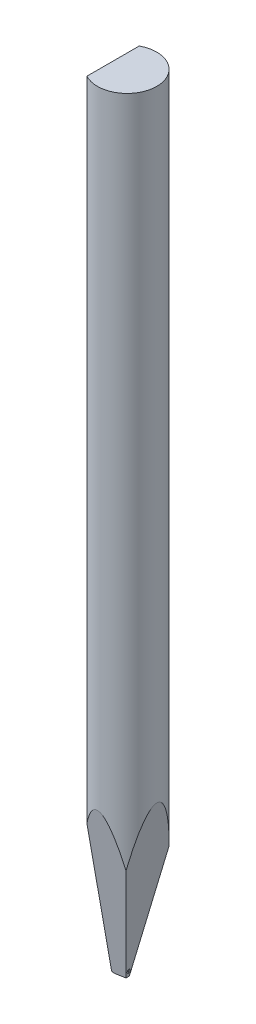
ISO-10303-21;
HEADER;
FILE_DESCRIPTION(('STEP AP214'),'2;1');
FILE_NAME('part.step','',(''),(''),'','','');
FILE_SCHEMA(('AUTOMOTIVE_DESIGN { 1 0 10303 214 1 1 1 1 }'));
ENDSEC;
DATA;
#1=APPLICATION_CONTEXT('core data for automotive mechanical design processes');
#2=APPLICATION_PROTOCOL_DEFINITION('international standard','automotive_design',2000,#1);
#3=PRODUCT_CONTEXT('',#1,'mechanical');
#4=PRODUCT('Part','Part','',(#3));
#5=PRODUCT_RELATED_PRODUCT_CATEGORY('part','',(#4));
#6=PRODUCT_DEFINITION_FORMATION('','',#4);
#7=PRODUCT_DEFINITION_CONTEXT('part definition',#1,'design');
#8=PRODUCT_DEFINITION('design','',#6,#7);
#9=PRODUCT_DEFINITION_SHAPE('','',#8);
#10=(LENGTH_UNIT() NAMED_UNIT(*) SI_UNIT(.MILLI.,.METRE.));
#11=(NAMED_UNIT(*) PLANE_ANGLE_UNIT() SI_UNIT($,.RADIAN.));
#12=(NAMED_UNIT(*) SI_UNIT($,.STERADIAN.) SOLID_ANGLE_UNIT());
#13=UNCERTAINTY_MEASURE_WITH_UNIT(LENGTH_MEASURE(1.E-05),#10,'distance_accuracy_value','');
#14=(GEOMETRIC_REPRESENTATION_CONTEXT(3) GLOBAL_UNCERTAINTY_ASSIGNED_CONTEXT((#13)) GLOBAL_UNIT_ASSIGNED_CONTEXT((#10,
#11,#12)) REPRESENTATION_CONTEXT('',''));
#15=CARTESIAN_POINT('',(0.,0.,0.));
#16=DIRECTION('',(0.,0.,1.));
#17=DIRECTION('',(1.,0.,0.));
#18=AXIS2_PLACEMENT_3D('',#15,#16,#17);
#19=CARTESIAN_POINT('',(26.8738719491216,0.,0.03556));
#20=DIRECTION('',(0.,-0.173648177666931,0.984807753012208));
#21=DIRECTION('',(0.,-0.984807753012208,-0.173648177666931));
#22=AXIS2_PLACEMENT_3D('',#19,#20,#21);
#23=PLANE('',#22);
#24=CARTESIAN_POINT('',(-0.3518916,0.02413,0.039814770044496));
#25=DIRECTION('',(0.,-0.173648177666931,0.984807753012208));
#26=DIRECTION('',(0.,-0.984807753012208,-0.173648177666931));
#27=AXIS2_PLACEMENT_3D('',#24,#25,#26);
#28=ELLIPSE('',#27,0.024502244144803,0.02413);
#29=CARTESIAN_POINT('',(-0.351891599999996,0.,0.0355486570961342));
#30=VERTEX_POINT('',#29);
#31=CARTESIAN_POINT('',(-0.37592,0.0219180114285934,0.0394247367783377));
#32=VERTEX_POINT('',#31);
#33=EDGE_CURVE('E213',#30,#32,#28,.F.);
#34=ORIENTED_EDGE('',*,*,#33,.F.);
#35=CARTESIAN_POINT('',(-0.279400000000003,0.,0.0355373141922684));
#36=DIRECTION('',(-1.,0.,0.));
#37=VECTOR('',#36,1.);
#38=LINE('',#35,#37);
#39=CARTESIAN_POINT('',(-0.279868505851268,-8.26102221984201E-05,0.0359894555492387));
#40=VERTEX_POINT('',#39);
#41=EDGE_CURVE('E241',#40,#30,#38,.T.);
#42=ORIENTED_EDGE('',*,*,#41,.F.);
#43=DIRECTION('',(-0.984346441568213,-0.173566836012845,-0.0306045161452665));
#44=VECTOR('',#43,1.);
#45=CARTESIAN_POINT('',(26.0304347628768,4.6391337266767,0.853564443127717));
#46=LINE('',#45,#44);
#47=CARTESIAN_POINT('',(0.0142086463569767,0.0517711261220242,0.0446886463569738));
#48=VERTEX_POINT('',#47);
#49=EDGE_CURVE('E417',#48,#40,#46,.T.);
#50=ORIENTED_EDGE('',*,*,#49,.F.);
#51=DIRECTION('',(-0.171087869746036,-0.970287525247814,-0.171087869746036));
#52=VECTOR('',#51,1.);
#53=CARTESIAN_POINT('',(0.791557999082992,4.46033837772866,0.822037999082991));
#54=LINE('',#53,#52);
#55=CARTESIAN_POINT('',(0.544920706940428,3.06158878676079,0.575400706940426));
#56=VERTEX_POINT('',#55);
#57=EDGE_CURVE('E424',#56,#48,#54,.T.);
#58=ORIENTED_EDGE('',*,*,#57,.F.);
#59=CARTESIAN_POINT('',(0.,-0.201670781505604,0.));
#60=DIRECTION('',(0.,-0.173648177666931,0.984807753012208));
#61=DIRECTION('',(0.,-0.984807753012208,-0.173648177666931));
#62=AXIS2_PLACEMENT_3D('',#59,#60,#61);
#63=ELLIPSE('',#62,4.56371043248163,0.792479999999998);
#64=CARTESIAN_POINT('',(-0.37592,3.75487126564512,0.69764511322018));
#65=VERTEX_POINT('',#64);
#66=EDGE_CURVE('E548',#56,#65,#63,.T.);
#67=ORIENTED_EDGE('',*,*,#66,.T.);
#68=DIRECTION('',(0.,0.984807753012208,0.173648177666931));
#69=VECTOR('',#68,1.);
#70=CARTESIAN_POINT('',(-0.37592,20.2537184461002,3.60683702172021));
#71=LINE('',#70,#69);
#72=EDGE_CURVE('E54',#32,#65,#71,.T.);
#73=ORIENTED_EDGE('',*,*,#72,.F.);
#74=EDGE_LOOP('',(#34,#42,#50,#58,#67,#73));
#75=FACE_BOUND('',#74,.T.);
#76=ADVANCED_FACE('F46',(#75),#23,.T.);
#77=CARTESIAN_POINT('',(26.8738719491216,0.,-0.03556));
#78=DIRECTION('',(0.,-0.173648177666931,-0.984807753012208));
#79=DIRECTION('',(0.,0.984807753012208,-0.173648177666931));
#80=AXIS2_PLACEMENT_3D('',#77,#78,#79);
#81=PLANE('',#80);
#82=CARTESIAN_POINT('',(-0.3518916,0.02413,-0.039814770044496));
#83=DIRECTION('',(0.,-0.173648177666931,-0.984807753012208));
#84=DIRECTION('',(0.,0.984807753012208,-0.173648177666931));
#85=AXIS2_PLACEMENT_3D('',#82,#83,#84);
#86=ELLIPSE('',#85,0.024502244144803,0.02413);
#87=CARTESIAN_POINT('',(-0.37592,0.0219180114285934,-0.0394247367783381));
#88=VERTEX_POINT('',#87);
#89=CARTESIAN_POINT('',(-0.35189160116382,0.,-0.0355486570961342));
#90=VERTEX_POINT('',#89);
#91=EDGE_CURVE('E173',#88,#90,#86,.F.);
#92=ORIENTED_EDGE('',*,*,#91,.F.);
#93=DIRECTION('',(0.,-0.984807753012208,0.173648177666931));
#94=VECTOR('',#93,1.);
#95=CARTESIAN_POINT('',(-0.37592,20.5281827638758,-3.65523248618578));
#96=LINE('',#95,#94);
#97=CARTESIAN_POINT('',(-0.37592,3.75487126564511,-0.69764511322018));
#98=VERTEX_POINT('',#97);
#99=EDGE_CURVE('E168',#98,#88,#96,.T.);
#100=ORIENTED_EDGE('',*,*,#99,.F.);
#101=CARTESIAN_POINT('',(0.,-0.201670781505604,0.));
#102=DIRECTION('',(0.,-0.173648177666931,-0.984807753012208));
#103=DIRECTION('',(0.,-0.984807753012208,0.173648177666931));
#104=AXIS2_PLACEMENT_3D('',#101,#102,#103);
#105=ELLIPSE('',#104,4.56371043248163,0.792479999999998);
#106=CARTESIAN_POINT('',(0.544920706940428,3.06158878676079,-0.575400706940426));
#107=VERTEX_POINT('',#106);
#108=EDGE_CURVE('E551',#98,#107,#105,.T.);
#109=ORIENTED_EDGE('',*,*,#108,.T.);
#110=DIRECTION('',(0.171087869746036,0.970287525247814,-0.171087869746036));
#111=VECTOR('',#110,1.);
#112=CARTESIAN_POINT('',(0.791557999082992,4.46033837772866,-0.822037999082991));
#113=LINE('',#112,#111);
#114=CARTESIAN_POINT('',(0.0142086463569767,0.0517711261220242,-0.0446886463569738));
#115=VERTEX_POINT('',#114);
#116=EDGE_CURVE('E562',#115,#107,#113,.T.);
#117=ORIENTED_EDGE('',*,*,#116,.F.);
#118=DIRECTION('',(0.984346441568213,0.173566836012845,-0.0306045161452665));
#119=VECTOR('',#118,1.);
#120=CARTESIAN_POINT('',(26.0304347628768,4.6391337266767,-0.853564443127717));
#121=LINE('',#120,#119);
#122=CARTESIAN_POINT('',(-0.279585789658038,-0.000190595003904677,-0.0363998842781737));
#123=VERTEX_POINT('',#122);
#124=EDGE_CURVE('E371',#123,#115,#121,.T.);
#125=ORIENTED_EDGE('',*,*,#124,.F.);
#126=CARTESIAN_POINT('',(-0.279399999999996,0.,-0.03556));
#127=DIRECTION('',(-1.,0.,0.));
#128=VECTOR('',#127,1.);
#129=LINE('',#126,#128);
#130=EDGE_CURVE('E236',#123,#90,#129,.T.);
#131=ORIENTED_EDGE('',*,*,#130,.T.);
#132=EDGE_LOOP('',(#92,#100,#109,#117,#125,#131));
#133=FACE_BOUND('',#132,.T.);
#134=ADVANCED_FACE('F373',(#133),#81,.T.);
#135=CARTESIAN_POINT('',(0.,21.0312,0.));
#136=DIRECTION('',(0.,-1.,0.));
#137=DIRECTION('',(0.,0.,-1.));
#138=AXIS2_PLACEMENT_3D('',#135,#136,#137);
#139=CYLINDRICAL_SURFACE('',#138,0.792479999999998);
#140=ORIENTED_EDGE('',*,*,#66,.F.);
#141=CARTESIAN_POINT('',(0.,-0.0288101116436568,0.));
#142=DIRECTION('',(-0.984807753012208,0.173648177666931,0.));
#143=DIRECTION('',(-0.173648177666931,-0.984807753012208,0.));
#144=AXIS2_PLACEMENT_3D('',#141,#142,#143);
#145=ELLIPSE('',#144,4.56371043248164,0.792479999999998);
#146=EDGE_CURVE('E544',#56,#107,#145,.T.);
#147=ORIENTED_EDGE('',*,*,#146,.T.);
#148=ORIENTED_EDGE('',*,*,#108,.F.);
#149=DIRECTION('',(0.,-1.,0.));
#150=VECTOR('',#149,1.);
#151=CARTESIAN_POINT('',(-0.37592,21.0312,-0.69764511322018));
#152=LINE('',#151,#150);
#153=CARTESIAN_POINT('',(-0.37592,21.0312,-0.69764511322018));
#154=VERTEX_POINT('',#153);
#155=EDGE_CURVE('E557',#154,#98,#152,.T.);
#156=ORIENTED_EDGE('',*,*,#155,.F.);
#157=CARTESIAN_POINT('',(0.,21.0312,0.));
#158=DIRECTION('',(0.,1.,0.));
#159=DIRECTION('',(0.,0.,1.));
#160=AXIS2_PLACEMENT_3D('',#157,#158,#159);
#161=CIRCLE('',#160,0.792479999999998);
#162=CARTESIAN_POINT('',(-0.37592,21.0312,0.69764511322018));
#163=VERTEX_POINT('',#162);
#164=EDGE_CURVE('E559',#163,#154,#161,.T.);
#165=ORIENTED_EDGE('',*,*,#164,.F.);
#166=DIRECTION('',(0.,-1.,0.));
#167=VECTOR('',#166,1.);
#168=CARTESIAN_POINT('',(-0.37592,21.0312,0.69764511322018));
#169=LINE('',#168,#167);
#170=EDGE_CURVE('E555',#65,#163,#169,.F.);
#171=ORIENTED_EDGE('',*,*,#170,.F.);
#172=EDGE_LOOP('',(#140,#147,#148,#156,#165,#171));
#173=FACE_BOUND('',#172,.T.);
#174=ADVANCED_FACE('F382',(#173),#139,.T.);
#175=CARTESIAN_POINT('',(-0.37592,21.0312,-0.80247998));
#176=DIRECTION('',(-1.,0.,0.));
#177=DIRECTION('',(0.,0.,1.));
#178=AXIS2_PLACEMENT_3D('',#175,#176,#177);
#179=PLANE('',#178);
#180=ORIENTED_EDGE('',*,*,#99,.T.);
#181=DIRECTION('',(0.,0.,-1.));
#182=VECTOR('',#181,1.);
#183=CARTESIAN_POINT('',(-0.37592,0.021918011428599,27.135653574335));
#184=LINE('',#183,#182);
#185=CARTESIAN_POINT('',(-0.375920000000287,0.0219181520865931,-0.010266726924701));
#186=VERTEX_POINT('',#185);
#187=EDGE_CURVE('E165',#186,#88,#184,.T.);
#188=ORIENTED_EDGE('',*,*,#187,.F.);
#189=CARTESIAN_POINT('',(-0.37592,0.,0.0355373141922684));
#190=CARTESIAN_POINT('',(-0.37592,0.0123359586796348,0.0261254448351633));
#191=CARTESIAN_POINT('',(-0.37592,0.0241300000000007,0.013381408455424));
#192=CARTESIAN_POINT('',(-0.37592,0.0241300000000007,-0.0133814084554238));
#193=CARTESIAN_POINT('',(-0.37592,0.0123359586796344,-0.026125444835163));
#194=CARTESIAN_POINT('',(-0.37592,0.,-0.0355373141922685));
#195=(BOUNDED_CURVE() B_SPLINE_CURVE(3,(#189,#190,#191,#192,#193,#194),.UNSPECIFIED.,.F.,
.F.) B_SPLINE_CURVE_WITH_KNOTS((4,2,4),(1.35718974229686,1.5707963267949,1.78440291129293),
.UNSPECIFIED.) CURVE() GEOMETRIC_REPRESENTATION_ITEM() RATIONAL_B_SPLINE_CURVE((1.,1.,1.,1.,1.,1.)) REPRESENTATION_ITEM(''));
#196=CARTESIAN_POINT('',(-0.37596017382226,0.0231418144616641,0.0105320158977709));
#197=VERTEX_POINT('',#196);
#198=EDGE_CURVE('E155',#186,#197,#195,.F.);
#199=ORIENTED_EDGE('',*,*,#198,.T.);
#200=EDGE_CURVE('E69',#32,#197,#184,.T.);
#201=ORIENTED_EDGE('',*,*,#200,.F.);
#202=ORIENTED_EDGE('',*,*,#72,.T.);
#203=ORIENTED_EDGE('',*,*,#170,.T.);
#204=DIRECTION('',(0.,0.,-1.));
#205=VECTOR('',#204,1.);
#206=CARTESIAN_POINT('',(-0.37592,21.0312,-0.80247998));
#207=LINE('',#206,#205);
#208=EDGE_CURVE('E553',#163,#154,#207,.T.);
#209=ORIENTED_EDGE('',*,*,#208,.T.);
#210=ORIENTED_EDGE('',*,*,#155,.T.);
#211=EDGE_LOOP('',(#180,#188,#199,#201,#202,#203,#209,#210));
#212=FACE_BOUND('',#211,.T.);
#213=ADVANCED_FACE('F166',(#212),#179,.T.);
#214=CARTESIAN_POINT('',(0.,21.0312,0.));
#215=DIRECTION('',(0.,1.,0.));
#216=DIRECTION('',(0.,0.,1.));
#217=AXIS2_PLACEMENT_3D('',#214,#215,#216);
#218=PLANE('',#217);
#219=ORIENTED_EDGE('',*,*,#164,.T.);
#220=ORIENTED_EDGE('',*,*,#208,.F.);
#221=EDGE_LOOP('',(#219,#220));
#222=FACE_BOUND('',#221,.T.);
#223=ADVANCED_FACE('F321',(#222),#218,.T.);
#224=CARTESIAN_POINT('',(-0.2794,0.,27.2760283406468));
#225=DIRECTION('',(-0.173648177666931,0.984807753012208,0.));
#226=DIRECTION('',(-0.984807753012208,-0.173648177666931,0.));
#227=AXIS2_PLACEMENT_3D('',#224,#225,#226);
#228=PLANE('',#227);
#229=DIRECTION('',(-0.984807753012208,-0.173648177666931,0.));
#230=VECTOR('',#229,1.);
#231=CARTESIAN_POINT('',(-0.2794,0.,-0.0228599999999995));
#232=LINE('',#231,#230);
#233=CARTESIAN_POINT('',(-0.1143,0.0291115845149677,-0.0228599999999998));
#234=VERTEX_POINT('',#233);
#235=CARTESIAN_POINT('',(-0.171062019412121,0.0191029090131131,-0.0228599999999995));
#236=VERTEX_POINT('',#235);
#237=EDGE_CURVE('E362',#234,#236,#232,.T.);
#238=ORIENTED_EDGE('',*,*,#237,.T.);
#239=CARTESIAN_POINT('',(-0.171062019412121,0.0191029090131133,-0.04318));
#240=DIRECTION('',(-0.173648177666931,0.984807753012208,0.));
#241=DIRECTION('',(-0.984807753012208,-0.173648177666931,0.));
#242=AXIS2_PLACEMENT_3D('',#239,#240,#241);
#243=ELLIPSE('',#242,0.117018216217478,0.02032);
#244=CARTESIAN_POINT('',(-0.267374476028883,0.00212042433326444,-0.0320221500864637));
#245=VERTEX_POINT('',#244);
#246=EDGE_CURVE('E278',#236,#245,#243,.F.);
#247=ORIENTED_EDGE('',*,*,#246,.T.);
#248=CARTESIAN_POINT('',(-0.280333497948036,-0.000164600883192114,-0.0364561339674381));
#249=CARTESIAN_POINT('',(-0.280155070497286,-0.000133136917720893,-0.036340628658351));
#250=CARTESIAN_POINT('',(-0.279973654415229,-0.000101068426490088,-0.0362300582978318));
#251=CARTESIAN_POINT('',(-0.279598555472457,-3.4658318876143E-05,-0.0360134000993459));
#252=CARTESIAN_POINT('',(-0.279404672441793,-2.77117807226393E-07,-0.0359076698614077));
#253=CARTESIAN_POINT('',(-0.279004881471679,7.06715381127732E-05,-0.0357002716689471));
#254=CARTESIAN_POINT('',(-0.278798804851058,0.000107271091862301,-0.035598942724127));
#255=CARTESIAN_POINT('',(-0.278374758328196,0.000182595203422804,-0.0353999293598517));
#256=CARTESIAN_POINT('',(-0.278156645520469,0.000221345659338753,-0.0353025606037825));
#257=CARTESIAN_POINT('',(-0.277708658167392,0.000300912638919081,-0.0351110156351709));
#258=CARTESIAN_POINT('',(-0.277478664625113,0.000341749351662017,-0.0350171276663814));
#259=CARTESIAN_POINT('',(-0.277007015949581,0.000425440776471455,-0.0348320822852496));
#260=CARTESIAN_POINT('',(-0.27676526231971,0.000468310873968494,-0.034741184281488));
#261=CARTESIAN_POINT('',(-0.276008109142046,0.000602458118121683,-0.0344664990491234));
#262=CARTESIAN_POINT('',(-0.275489221156904,0.000694221265936668,-0.0342925905564617));
#263=CARTESIAN_POINT('',(-0.274405958507615,0.000885393058399262,-0.0339485287291992));
#264=CARTESIAN_POINT('',(-0.273841176891778,0.000984842757572743,-0.0337797124463461));
#265=CARTESIAN_POINT('',(-0.272666201099527,0.00119139278403715,-0.0334413186521607));
#266=CARTESIAN_POINT('',(-0.272055759373374,0.00129851092615172,-0.0332726220357182));
#267=CARTESIAN_POINT('',(-0.270789526175272,0.0015205709643942,-0.0329293232876879));
#268=CARTESIAN_POINT('',(-0.270133618528723,0.00163552364341038,-0.0327551637623434));
#269=CARTESIAN_POINT('',(-0.268776345142181,0.00187368786077839,-0.0323957280937868));
#270=CARTESIAN_POINT('',(-0.268074966685623,0.00199692178243328,-0.0322105143972571));
#271=CARTESIAN_POINT('',(-0.267374476031968,0.00212042435076266,-0.0320221500864627));
#272=B_SPLINE_CURVE_WITH_KNOTS('',3,(#248,#249,#250,#251,#252,#253,#254,#255,#256,#257,#258,
#259,#260,#261,#262,#263,#264,#265,#266,#267,#268,#269,#270,#271),.UNSPECIFIED.,.F.,.F.,(4,2,2,
2,2,2,2,2,2,2,2,4),(0.,0.000644403256786334,0.00131464962442115,0.00201209736790709,
0.00273790077589257,0.00349304918435483,0.00427840099063897,0.00594258166803204,
0.00773581701858617,0.00966269499168276,0.0117276015745993,0.0139350378186592),.UNSPECIFIED.);
#273=EDGE_CURVE('E341',#245,#123,#272,.F.);
#274=ORIENTED_EDGE('',*,*,#273,.T.);
#275=ORIENTED_EDGE('',*,*,#124,.T.);
#276=DIRECTION('',(0.,0.,-1.));
#277=VECTOR('',#276,1.);
#278=CARTESIAN_POINT('',(0.0142086463569737,0.0517711261220249,27.2760283406468));
#279=LINE('',#278,#277);
#280=EDGE_CURVE('E423',#48,#115,#279,.T.);
#281=ORIENTED_EDGE('',*,*,#280,.F.);
#282=ORIENTED_EDGE('',*,*,#49,.T.);
#283=CARTESIAN_POINT('',(-0.267374173647564,0.00215307346705205,0.0320435292332376));
#284=CARTESIAN_POINT('',(-0.268082885431075,0.00202931965629134,0.0322349808760758));
#285=CARTESIAN_POINT('',(-0.268792438835196,0.00190513734656913,0.0324229896451083));
#286=CARTESIAN_POINT('',(-0.270162321116317,0.00166463826845671,0.0327863461831401));
#287=CARTESIAN_POINT('',(-0.270822664633382,0.00154837070814446,0.0329616714506038));
#288=CARTESIAN_POINT('',(-0.272095067230392,0.00132351987416095,0.0333058478048767));
#289=CARTESIAN_POINT('',(-0.272707243817517,0.00121497360617393,0.0334742820909874));
#290=CARTESIAN_POINT('',(-0.273883763905877,0.00100557278077867,0.0338109189836498));
#291=CARTESIAN_POINT('',(-0.274448355665751,0.000904731491622197,0.033978251939496));
#292=CARTESIAN_POINT('',(-0.275529898733176,0.000710867252534142,0.0343182959951879));
#293=CARTESIAN_POINT('',(-0.276047256219702,0.000617823388709614,0.0344896698862049));
#294=CARTESIAN_POINT('',(-0.276801873122328,0.000481711213552321,0.0347599859975484));
#295=CARTESIAN_POINT('',(-0.277042507217535,0.000438246834182285,0.0348492792422128));
#296=CARTESIAN_POINT('',(-0.277511738389133,0.000353391187461877,0.0350309150056344));
#297=CARTESIAN_POINT('',(-0.277740433873042,0.000311986160541231,0.0351229954457454));
#298=CARTESIAN_POINT('',(-0.278185686137927,0.000231301139131407,0.0353107436831354));
#299=CARTESIAN_POINT('',(-0.278402361946502,0.000192002508565462,0.0354061195792356));
#300=CARTESIAN_POINT('',(-0.278823429759548,0.000115592439001881,0.0356009843447664));
#301=CARTESIAN_POINT('',(-0.279027964989783,7.84566637652888E-05,0.0357001527662635));
#302=CARTESIAN_POINT('',(-0.279424599746804,6.43603412709969E-06,0.0359030845817691));
#303=CARTESIAN_POINT('',(-0.279616868669867,-2.84792977134749E-05,0.0360065030545373));
#304=CARTESIAN_POINT('',(-0.27998869205088,-9.5968954295525E-05,0.0362184129740459));
#305=CARTESIAN_POINT('',(-0.280168448168133,-0.000128581175170421,0.036326539653624));
#306=CARTESIAN_POINT('',(-0.280345277736324,-0.000160629395019782,0.0364395611564484));
#307=B_SPLINE_CURVE_WITH_KNOTS('',3,(#283,#284,#285,#286,#287,#288,#289,#290,#291,#292,#293,
#294,#295,#296,#297,#298,#299,#300,#301,#302,#303,#304,#305,#306),.UNSPECIFIED.,.F.,.F.,(4,2,2,
2,2,2,2,2,2,2,2,4),(0.,0.00223340647109862,0.00431253981722064,0.00624488707666015,
0.00803705014398884,0.0096952366864093,0.0104761224270785,0.0112259848073902,0.0119457789440838,
0.0126365778181985,0.0132996096991451,0.0139363005881362),.UNSPECIFIED.);
#308=CARTESIAN_POINT('',(-0.267374257696495,0.00212046283115514,0.0320220915086163));
#309=VERTEX_POINT('',#308);
#310=EDGE_CURVE('E349',#40,#309,#307,.F.);
#311=ORIENTED_EDGE('',*,*,#310,.T.);
#312=CARTESIAN_POINT('',(-0.171062019412121,0.0191029090131133,0.04318));
#313=DIRECTION('',(-0.173648177666931,0.984807753012208,0.));
#314=DIRECTION('',(-0.984807753012208,-0.173648177666931,0.));
#315=AXIS2_PLACEMENT_3D('',#312,#313,#314);
#316=ELLIPSE('',#315,0.117018216217478,0.02032);
#317=CARTESIAN_POINT('',(-0.17106201941212,0.0191029090131133,0.0228599999999998));
#318=VERTEX_POINT('',#317);
#319=EDGE_CURVE('E345',#309,#318,#316,.F.);
#320=ORIENTED_EDGE('',*,*,#319,.T.);
#321=DIRECTION('',(-0.984807753012208,-0.173648177666931,0.));
#322=VECTOR('',#321,1.);
#323=CARTESIAN_POINT('',(-0.2794,0.,0.0228599999999995));
#324=LINE('',#323,#322);
#325=CARTESIAN_POINT('',(-0.1143,0.0291115845149677,0.0228599999999998));
#326=VERTEX_POINT('',#325);
#327=EDGE_CURVE('E353',#326,#318,#324,.T.);
#328=ORIENTED_EDGE('',*,*,#327,.F.);
#329=DIRECTION('',(0.,0.,1.));
#330=VECTOR('',#329,1.);
#331=CARTESIAN_POINT('',(-0.1143,0.0291115845149677,27.2760283406468));
#332=LINE('',#331,#330);
#333=EDGE_CURVE('E358',#234,#326,#332,.T.);
#334=ORIENTED_EDGE('',*,*,#333,.F.);
#335=EDGE_LOOP('',(#238,#247,#274,#275,#281,#282,#311,#320,#328,#334));
#336=FACE_BOUND('',#335,.T.);
#337=ADVANCED_FACE('F316',(#336),#228,.F.);
#338=CARTESIAN_POINT('',(0.0142086463569737,0.0517711261220249,27.2760283406468));
#339=DIRECTION('',(-0.984807753012208,0.173648177666931,0.));
#340=DIRECTION('',(-0.173648177666931,-0.984807753012208,0.));
#341=AXIS2_PLACEMENT_3D('',#338,#339,#340);
#342=PLANE('',#341);
#343=CARTESIAN_POINT('',(0.0401727059586961,0.199020625304743,0.));
#344=DIRECTION('',(-0.984807753012208,0.173648177666931,0.));
#345=DIRECTION('',(0.173648177666931,0.984807753012208,0.));
#346=AXIS2_PLACEMENT_3D('',#343,#344,#345);
#347=ELLIPSE('',#346,0.0515734368592615,0.0370444608655554);
#348=CARTESIAN_POINT('',(0.0491283392853274,0.249810545773229,0.));
#349=VERTEX_POINT('',#348);
#350=EDGE_CURVE('E539',#349,#349,#347,.F.);
#351=ORIENTED_EDGE('',*,*,#350,.F.);
#352=EDGE_LOOP('',(#351));
#353=FACE_BOUND('',#352,.T.);
#354=ORIENTED_EDGE('',*,*,#146,.F.);
#355=ORIENTED_EDGE('',*,*,#57,.T.);
#356=ORIENTED_EDGE('',*,*,#280,.T.);
#357=ORIENTED_EDGE('',*,*,#116,.T.);
#358=EDGE_LOOP('',(#354,#355,#356,#357));
#359=FACE_BOUND('',#358,.T.);
#360=ADVANCED_FACE('F311',(#353,#359),#342,.F.);
#361=CARTESIAN_POINT('',(-0.224144167394209,0.0939800000000001,0.));
#362=DIRECTION('',(-0.500000000000004,-0.866025403784436,0.));
#363=DIRECTION('',(0.866025403784436,-0.500000000000004,0.));
#364=AXIS2_PLACEMENT_3D('',#361,#362,#363);
#365=CYLINDRICAL_SURFACE('',#364,0.02286);
#366=DIRECTION('',(-0.500000000000004,-0.866025403784436,0.));
#367=VECTOR('',#366,1.);
#368=CARTESIAN_POINT('',(-0.208802659269487,0.120552271536749,0.02286));
#369=LINE('',#368,#367);
#370=CARTESIAN_POINT('',(-0.224144167394209,0.0939800000000001,0.02286));
#371=VERTEX_POINT('',#370);
#372=CARTESIAN_POINT('',(-0.267372013928851,0.0191071735002097,0.02286));
#373=VERTEX_POINT('',#372);
#374=EDGE_CURVE('E260',#371,#373,#369,.T.);
#375=ORIENTED_EDGE('',*,*,#374,.T.);
#376=CARTESIAN_POINT('',(-0.267374476031878,0.0191029090130334,-0.02286));
#377=CARTESIAN_POINT('',(-0.275895760983117,0.0164196561236254,-0.0228599999999525));
#378=CARTESIAN_POINT('',(-0.283804636099305,0.0149415704065285,-0.0204869191309508));
#379=CARTESIAN_POINT('',(-0.294991553142782,0.0138166529596041,-0.0107104045754606));
#380=CARTESIAN_POINT('',(-0.297768361827201,0.0139542855985028,-0.00310771898830106));
#381=CARTESIAN_POINT('',(-0.294909474530602,0.0139949484763086,0.0109660536144084));
#382=CARTESIAN_POINT('',(-0.28955299666881,0.0140922856862379,0.0168379500019212));
#383=CARTESIAN_POINT('',(-0.27538921998688,0.0165985464362655,0.0230240317134643));
#384=CARTESIAN_POINT('',(-0.26693681668608,0.0189220985514332,0.0238016005882103));
#385=CARTESIAN_POINT('',(-0.257498919852931,0.0225827524218857,0.0218212881158467));
#386=(BOUNDED_CURVE() B_SPLINE_CURVE(3,(#376,#377,#378,#379,#380,#381,#382,#383,#384,#385),
.UNSPECIFIED.,.F.,.F.) B_SPLINE_CURVE_WITH_KNOTS((4,2,2,2,4),(-1.47682958571218E-05,
9.3852680534188E-06,3.35388319639594E-05,5.76923958745E-05,8.18459597850407E-05),
.UNSPECIFIED.) CURVE() GEOMETRIC_REPRESENTATION_ITEM() RATIONAL_B_SPLINE_CURVE((1.,1.,1.,1.,1.,
1.,1.,1.,1.,1.)) REPRESENTATION_ITEM(''));
#387=CARTESIAN_POINT('',(-0.267374476031722,0.0191029090129434,-0.02286));
#388=VERTEX_POINT('',#387);
#389=EDGE_CURVE('E284',#373,#388,#386,.F.);
#390=ORIENTED_EDGE('',*,*,#389,.T.);
#391=DIRECTION('',(0.500000000000004,0.866025403784436,0.));
#392=VECTOR('',#391,1.);
#393=CARTESIAN_POINT('',(-0.224144167394209,0.0939800000000001,-0.02286));
#394=LINE('',#393,#392);
#395=CARTESIAN_POINT('',(-0.224144167394209,0.0939800000000001,-0.02286));
#396=VERTEX_POINT('',#395);
#397=EDGE_CURVE('E272',#388,#396,#394,.T.);
#398=ORIENTED_EDGE('',*,*,#397,.T.);
#399=CARTESIAN_POINT('',(-0.224144167394209,0.0939800000000001,0.));
#400=DIRECTION('',(0.,-1.,0.));
#401=DIRECTION('',(-1.,0.,0.));
#402=AXIS2_PLACEMENT_3D('',#399,#400,#401);
#403=ELLIPSE('',#402,0.0263964543073498,0.02286);
#404=EDGE_CURVE('E282',#396,#371,#403,.F.);
#405=ORIENTED_EDGE('',*,*,#404,.T.);
#406=EDGE_LOOP('',(#375,#390,#398,#405));
#407=FACE_BOUND('',#406,.T.);
#408=ADVANCED_FACE('F297',(#407),#365,.F.);
#409=CARTESIAN_POINT('',(-0.1143,0.0939800000000001,0.02286));
#410=DIRECTION('',(-1.,0.,0.));
#411=DIRECTION('',(0.,0.,1.));
#412=AXIS2_PLACEMENT_3D('',#409,#410,#411);
#413=PLANE('',#412);
#414=ORIENTED_EDGE('',*,*,#333,.T.);
#415=DIRECTION('',(0.,1.,0.));
#416=VECTOR('',#415,1.);
#417=CARTESIAN_POINT('',(-0.1143,0.0939800000000001,0.02286));
#418=LINE('',#417,#416);
#419=CARTESIAN_POINT('',(-0.1143,0.0939800000000001,0.02286));
#420=VERTEX_POINT('',#419);
#421=EDGE_CURVE('E257',#326,#420,#418,.T.);
#422=ORIENTED_EDGE('',*,*,#421,.T.);
#423=CARTESIAN_POINT('',(-0.1143,0.09398,0.));
#424=DIRECTION('',(1.,0.,0.));
#425=DIRECTION('',(0.,1.,0.));
#426=AXIS2_PLACEMENT_3D('',#423,#424,#425);
#427=ELLIPSE('',#426,0.0263964543073496,0.02286);
#428=CARTESIAN_POINT('',(-0.1143,0.0939800000000001,-0.0228599999999995));
#429=VERTEX_POINT('',#428);
#430=EDGE_CURVE('E250',#429,#420,#427,.F.);
#431=ORIENTED_EDGE('',*,*,#430,.F.);
#432=DIRECTION('',(0.,1.,0.));
#433=VECTOR('',#432,1.);
#434=CARTESIAN_POINT('',(-0.1143,0.0939800000000001,-0.02286));
#435=LINE('',#434,#433);
#436=EDGE_CURVE('E258',#234,#429,#435,.T.);
#437=ORIENTED_EDGE('',*,*,#436,.F.);
#438=EDGE_LOOP('',(#414,#422,#431,#437));
#439=FACE_BOUND('',#438,.T.);
#440=ADVANCED_FACE('F310',(#439),#413,.T.);
#441=CARTESIAN_POINT('',(0.,0.,0.02286));
#442=DIRECTION('',(0.,0.,-1.));
#443=DIRECTION('',(-1.,0.,0.));
#444=AXIS2_PLACEMENT_3D('',#441,#442,#443);
#445=PLANE('',#444);
#446=ORIENTED_EDGE('',*,*,#327,.T.);
#447=DIRECTION('',(1.,0.,0.));
#448=VECTOR('',#447,1.);
#449=CARTESIAN_POINT('',(-0.277107942966048,0.0191029090131133,0.02286));
#450=LINE('',#449,#448);
#451=EDGE_CURVE('E275',#318,#373,#450,.F.);
#452=ORIENTED_EDGE('',*,*,#451,.T.);
#453=ORIENTED_EDGE('',*,*,#374,.F.);
#454=DIRECTION('',(-1.,0.,0.));
#455=VECTOR('',#454,1.);
#456=CARTESIAN_POINT('',(-0.250540621701558,0.0939800000000001,0.02286));
#457=LINE('',#456,#455);
#458=EDGE_CURVE('E254',#420,#371,#457,.T.);
#459=ORIENTED_EDGE('',*,*,#458,.F.);
#460=ORIENTED_EDGE('',*,*,#421,.F.);
#461=EDGE_LOOP('',(#446,#452,#453,#459,#460));
#462=FACE_BOUND('',#461,.T.);
#463=ADVANCED_FACE('F534',(#462),#445,.T.);
#464=CARTESIAN_POINT('',(0.,0.,-0.02286));
#465=DIRECTION('',(0.,0.,-1.));
#466=DIRECTION('',(-1.,0.,0.));
#467=AXIS2_PLACEMENT_3D('',#464,#465,#466);
#468=PLANE('',#467);
#469=ORIENTED_EDGE('',*,*,#397,.F.);
#470=DIRECTION('',(-1.,0.,0.));
#471=VECTOR('',#470,1.);
#472=CARTESIAN_POINT('',(0.,0.0191029090131133,-0.02286));
#473=LINE('',#472,#471);
#474=EDGE_CURVE('E277',#388,#236,#473,.F.);
#475=ORIENTED_EDGE('',*,*,#474,.T.);
#476=ORIENTED_EDGE('',*,*,#237,.F.);
#477=ORIENTED_EDGE('',*,*,#436,.T.);
#478=DIRECTION('',(-1.,0.,0.));
#479=VECTOR('',#478,1.);
#480=CARTESIAN_POINT('',(-0.250540621701558,0.0939800000000001,-0.02286));
#481=LINE('',#480,#479);
#482=EDGE_CURVE('E253',#429,#396,#481,.T.);
#483=ORIENTED_EDGE('',*,*,#482,.T.);
#484=EDGE_LOOP('',(#469,#475,#476,#477,#483));
#485=FACE_BOUND('',#484,.T.);
#486=ADVANCED_FACE('F700',(#485),#468,.F.);
#487=CARTESIAN_POINT('',(0.0122322627883964,0.167033435982052,0.));
#488=DIRECTION('',(0.866025403784441,0.499999999999995,0.));
#489=DIRECTION('',(-0.499999999999995,0.866025403784441,0.));
#490=AXIS2_PLACEMENT_3D('',#487,#488,#489);
#491=CONICAL_SURFACE('',#490,0.02286,0.392699081698725);
#492=CARTESIAN_POINT('',(0.0122322627883964,0.167033435982052,0.));
#493=DIRECTION('',(0.866025403784441,0.499999999999995,0.));
#494=DIRECTION('',(-0.499999999999995,0.866025403784441,0.));
#495=AXIS2_PLACEMENT_3D('',#492,#493,#494);
#496=CIRCLE('',#495,0.02286);
#497=CARTESIAN_POINT('',(0.00080226278839655,0.186830776712565,0.));
#498=VERTEX_POINT('',#497);
#499=EDGE_CURVE('E243',#498,#498,#496,.T.);
#500=ORIENTED_EDGE('',*,*,#499,.F.);
#501=EDGE_LOOP('',(#500));
#502=FACE_BOUND('',#501,.T.);
#503=ORIENTED_EDGE('',*,*,#350,.T.);
#504=EDGE_LOOP('',(#503));
#505=FACE_BOUND('',#504,.T.);
#506=ADVANCED_FACE('F691',(#502,#505),#491,.F.);
#507=CARTESIAN_POINT('',(-0.250540621701558,0.0939800000000001,0.02286));
#508=DIRECTION('',(0.,-1.,0.));
#509=DIRECTION('',(0.,0.,-1.));
#510=AXIS2_PLACEMENT_3D('',#507,#508,#509);
#511=PLANE('',#510);
#512=ORIENTED_EDGE('',*,*,#482,.F.);
#513=CARTESIAN_POINT('',(-0.1143,0.0939800000000001,0.));
#514=DIRECTION('',(0.,1.,0.));
#515=DIRECTION('',(1.,0.,0.));
#516=AXIS2_PLACEMENT_3D('',#513,#514,#515);
#517=ELLIPSE('',#516,0.0457200000000004,0.02286);
#518=EDGE_CURVE('E246',#420,#429,#517,.F.);
#519=ORIENTED_EDGE('',*,*,#518,.F.);
#520=ORIENTED_EDGE('',*,*,#458,.T.);
#521=ORIENTED_EDGE('',*,*,#404,.F.);
#522=EDGE_LOOP('',(#512,#519,#520,#521));
#523=FACE_BOUND('',#522,.T.);
#524=ADVANCED_FACE('F312',(#523),#511,.T.);
#525=CARTESIAN_POINT('',(-0.361071138175361,-0.0484933830537733,0.));
#526=DIRECTION('',(0.866025403784441,0.499999999999995,0.));
#527=DIRECTION('',(-0.499999999999995,0.866025403784441,0.));
#528=AXIS2_PLACEMENT_3D('',#525,#526,#527);
#529=CYLINDRICAL_SURFACE('',#528,0.02286);
#530=ORIENTED_EDGE('',*,*,#430,.T.);
#531=ORIENTED_EDGE('',*,*,#518,.T.);
#532=EDGE_LOOP('',(#530,#531));
#533=FACE_BOUND('',#532,.T.);
#534=ORIENTED_EDGE('',*,*,#499,.T.);
#535=EDGE_LOOP('',(#534));
#536=FACE_BOUND('',#535,.T.);
#537=ADVANCED_FACE('F607',(#533,#536),#529,.F.);
#538=CARTESIAN_POINT('',(26.7532219491216,-0.16383,0.));
#539=DIRECTION('',(-1.,0.,0.));
#540=DIRECTION('',(0.,0.,1.));
#541=AXIS2_PLACEMENT_3D('',#538,#539,#540);
#542=CYLINDRICAL_SURFACE('',#541,0.16764);
#543=ORIENTED_EDGE('',*,*,#41,.T.);
#544=CARTESIAN_POINT('',(-0.3518916,0.,0.0355373141922684));
#545=CARTESIAN_POINT('',(-0.352251268342653,-3.1644969071811E-07,0.0355385995095474));
#546=CARTESIAN_POINT('',(-0.352609039601553,8.02818367780947E-06,0.035500318254268));
#547=CARTESIAN_POINT('',(-0.353305255703916,3.90463941921952E-05,0.0353569439486636));
#548=CARTESIAN_POINT('',(-0.353643903507041,6.15137569732996E-05,0.0352528122895414));
#549=CARTESIAN_POINT('',(-0.354295214243823,0.000117763185050622,0.0349902438494591));
#550=CARTESIAN_POINT('',(-0.354608022572586,0.000151475665794418,0.0348321409041775));
#551=CARTESIAN_POINT('',(-0.355208581302935,0.000227153868779776,0.034473962319524));
#552=CARTESIAN_POINT('',(-0.355496229178868,0.000269151278077996,0.0342737253292812));
#553=CARTESIAN_POINT('',(-0.356270710683659,0.000395250314370916,0.0336659216504462));
#554=CARTESIAN_POINT('',(-0.356728260395176,0.000485716625125136,0.0332226300592517));
#555=CARTESIAN_POINT('',(-0.357573022670499,0.000674415716683586,0.0322754539316978));
#556=CARTESIAN_POINT('',(-0.357960019343308,0.000772671057965837,0.0317713910024807));
#557=CARTESIAN_POINT('',(-0.359058129172298,0.00107580067057533,0.0301733027579081));
#558=CARTESIAN_POINT('',(-0.359679433698047,0.00128358971705124,0.0290188780669844));
#559=CARTESIAN_POINT('',(-0.360766848765377,0.00168436492622039,0.0266393127268761));
#560=CARTESIAN_POINT('',(-0.361232581402639,0.00187731417930728,0.0254140082426635));
#561=CARTESIAN_POINT('',(-0.362622871092907,0.00248985705969784,0.0212073753235609));
#562=CARTESIAN_POINT('',(-0.36329409987197,0.00285492843747878,0.0181353476658935));
#563=CARTESIAN_POINT('',(-0.364278279349108,0.00341576574656757,0.011914135200303));
#564=CARTESIAN_POINT('',(-0.364589261352639,0.00361059994835304,0.00876462159404117));
#565=CARTESIAN_POINT('',(-0.365009678841964,0.00387434920441847,0.000878520987366361));
#566=CARTESIAN_POINT('',(-0.364942834586346,0.00383299736486849,-0.00387100770457962));
#567=CARTESIAN_POINT('',(-0.36416903131961,0.0033480122256045,-0.0132807766905089));
#568=CARTESIAN_POINT('',(-0.36346762607949,0.00290786915558281,-0.0179414340867087));
#569=CARTESIAN_POINT('',(-0.361937525669933,0.00218943506643746,-0.0232698617756675));
#570=CARTESIAN_POINT('',(-0.361670936734846,0.00206830252842352,-0.0241173628313344));
#571=CARTESIAN_POINT('',(-0.361081100183904,0.00181590566569847,-0.0257937219690029));
#572=CARTESIAN_POINT('',(-0.360757711149149,0.00168461652098595,-0.0266225275511856));
#573=CARTESIAN_POINT('',(-0.359987399278323,0.00139436321864785,-0.0283722163485569));
#574=CARTESIAN_POINT('',(-0.359529178320922,0.00123422218073195,-0.029287993525864));
#575=CARTESIAN_POINT('',(-0.35848806022634,0.00091265778824753,-0.0310452521133025));
#576=CARTESIAN_POINT('',(-0.357905783819933,0.000751244535880948,-0.0318870749858256));
#577=CARTESIAN_POINT('',(-0.356962212388882,0.000537175877259494,-0.0329652175868421));
#578=CARTESIAN_POINT('',(-0.356674976179315,0.000476848448842134,-0.0332642866227097));
#579=CARTESIAN_POINT('',(-0.356065905294942,0.000361768756805535,-0.0338277165810855));
#580=CARTESIAN_POINT('',(-0.355744027249446,0.000307023653007552,-0.0340920330529995));
#581=CARTESIAN_POINT('',(-0.355057783372287,0.000206073174392215,-0.0345745305900033));
#582=CARTESIAN_POINT('',(-0.354692840587474,0.000160011974018704,-0.0347919401869191));
#583=CARTESIAN_POINT('',(-0.35392739307815,8.30042228159121E-05,-0.0351529694942786));
#584=CARTESIAN_POINT('',(-0.35352709751998,5.19749993899241E-05,-0.0352969930442584));
#585=CARTESIAN_POINT('',(-0.35291574394059,2.09077143094453E-05,-0.0354408230247105));
#586=CARTESIAN_POINT('',(-0.352713284747334,1.31384500590778E-05,-0.0354767046674955));
#587=CARTESIAN_POINT('',(-0.352304505346337,2.655768193882E-06,-0.0355250720129181));
#588=CARTESIAN_POINT('',(-0.352098171370407,-3.34685002867517E-08,-0.0355374458198908));
#589=CARTESIAN_POINT('',(-0.351891600000658,-1.69125610184529E-13,-0.0355373141950322));
#590=B_SPLINE_CURVE_WITH_KNOTS('',3,(#544,#545,#546,#547,#548,#549,#550,#551,#552,#553,#554,
#555,#556,#557,#558,#559,#560,#561,#562,#563,#564,#565,#566,#567,#568,#569,#570,#571,#572,#573,
#574,#575,#576,#577,#578,#579,#580,#581,#582,#583,#584,#585,#586,#587,#588,#589),.UNSPECIFIED.,
.F.,.F.,(4,2,2,2,2,2,2,2,2,2,2,2,2,2,2,2,2,2,2,2,2,2,4),(0.,0.00107387793307747,
0.00213242859854409,0.00318454687300627,0.00424077001276429,0.0061599933015218,
0.00808499425946905,0.0120448307551851,0.0160142174212676,0.0254592668811319,0.0349556921836507,
0.0491587337563986,0.0632386581819932,0.0659271174774281,0.0686223678254726,0.0717265046140596,
0.07481545959662,0.0760704044702183,0.0773269391934501,0.0786027851340055,0.0798715322106305,
0.0804875134550958,0.0811064194522882),.UNSPECIFIED.);
#591=CARTESIAN_POINT('',(-0.36293584853417,0.00268715662575408,0.0193637586740646));
#592=VERTEX_POINT('',#591);
#593=EDGE_CURVE('E172',#30,#592,#590,.T.);
#594=ORIENTED_EDGE('',*,*,#593,.T.);
#595=CARTESIAN_POINT('',(-0.37592,0.,-0.0355373141922685));
#596=CARTESIAN_POINT('',(-0.365756940225437,0.00252981156072762,-0.0238746706466237));
#597=CARTESIAN_POINT('',(-0.355600000000001,0.00381000000000001,-0.0119362651530878));
#598=CARTESIAN_POINT('',(-0.355600000000001,0.00381,0.0119362651530881));
#599=CARTESIAN_POINT('',(-0.365756940225437,0.00252981156072763,0.0238746706466237));
#600=CARTESIAN_POINT('',(-0.37592,0.,0.0355373141922684));
#601=(BOUNDED_CURVE() B_SPLINE_CURVE(3,(#595,#596,#597,#598,#599,#600),.UNSPECIFIED.,.F.,
.F.) B_SPLINE_CURVE_WITH_KNOTS((4,2,4),(1.35718974229686,1.5707963267949,1.78440291129293),
.UNSPECIFIED.) CURVE() GEOMETRIC_REPRESENTATION_ITEM() RATIONAL_B_SPLINE_CURVE((1.,1.,1.,1.,1.,1.)) REPRESENTATION_ITEM(''));
#602=CARTESIAN_POINT('',(-0.362935844075033,0.00268715033781386,-0.0193638128291611));
#603=VERTEX_POINT('',#602);
#604=EDGE_CURVE('E161',#592,#603,#601,.F.);
#605=ORIENTED_EDGE('',*,*,#604,.T.);
#606=EDGE_CURVE('E177',#603,#90,#590,.T.);
#607=ORIENTED_EDGE('',*,*,#606,.T.);
#608=ORIENTED_EDGE('',*,*,#130,.F.);
#609=CARTESIAN_POINT('',(-0.252254608086328,-0.000270452130083687,0.0367619898888589));
#610=CARTESIAN_POINT('',(-0.266550763626959,-0.00101788685857537,0.0400874379025213));
#611=CARTESIAN_POINT('',(-0.279769047903016,-0.000652592886808862,0.0387891867380597));
#612=CARTESIAN_POINT('',(-0.302409492391317,0.00147836399758748,0.0283656833590313));
#613=CARTESIAN_POINT('',(-0.311301519190337,0.0032107858808008,0.0184745739404699));
#614=CARTESIAN_POINT('',(-0.31604781236029,0.00414773920570411,-0.00523575794873937));
#615=CARTESIAN_POINT('',(-0.311366616837755,0.00304479400031683,-0.0180422535986573));
#616=CARTESIAN_POINT('',(-0.293158016310094,0.000430180690803196,-0.0345153998526844));
#617=CARTESIAN_POINT('',(-0.280497853536508,-0.000673407158551885,-0.038510983020977));
#618=CARTESIAN_POINT('',(-0.267374476032017,-0.000673621691007033,-0.0385118918918919));
#619=(BOUNDED_CURVE() B_SPLINE_CURVE(3,(#609,#610,#611,#612,#613,#614,#615,#616,#617,#618),
.UNSPECIFIED.,.F.,.F.) B_SPLINE_CURVE_WITH_KNOTS((4,2,2,2,4),(-1.47682958571218E-05,
9.3852680534188E-06,3.35388319639594E-05,5.76923958745E-05,8.18459597850407E-05),
.UNSPECIFIED.) CURVE() GEOMETRIC_REPRESENTATION_ITEM() RATIONAL_B_SPLINE_CURVE((1.,1.,1.,1.,1.,
1.,1.,1.,1.,1.)) REPRESENTATION_ITEM(''));
#620=EDGE_CURVE('E411',#123,#40,#619,.F.);
#621=ORIENTED_EDGE('',*,*,#620,.T.);
#622=EDGE_LOOP('',(#543,#594,#605,#607,#608,#621));
#623=FACE_BOUND('',#622,.T.);
#624=ADVANCED_FACE('F189',(#623),#542,.F.);
#625=CARTESIAN_POINT('',(26.7532219491216,0.0191029090131133,-0.04318));
#626=DIRECTION('',(-1.,0.,0.));
#627=DIRECTION('',(0.,0.,1.));
#628=AXIS2_PLACEMENT_3D('',#625,#626,#627);
#629=CYLINDRICAL_SURFACE('',#628,0.02032);
#630=ORIENTED_EDGE('',*,*,#246,.F.);
#631=ORIENTED_EDGE('',*,*,#474,.F.);
#632=CARTESIAN_POINT('',(-0.267374476032017,-0.000673621691007033,-0.0385118918918919));
#633=CARTESIAN_POINT('',(-0.267374476031904,0.0030208950339236,-0.0228600000000633));
#634=CARTESIAN_POINT('',(-0.267374476031878,0.0191029090130334,-0.02286));
#635=(BOUNDED_CURVE() B_SPLINE_CURVE(2,(#632,#633,#634),.UNSPECIFIED.,.F.,
.F.) B_SPLINE_CURVE_WITH_KNOTS((3,3),(0.,1.),
.UNSPECIFIED.) CURVE() GEOMETRIC_REPRESENTATION_ITEM() RATIONAL_B_SPLINE_CURVE((1.,
0.784133193320357,1.)) REPRESENTATION_ITEM(''));
#636=EDGE_CURVE('E247',#245,#388,#635,.T.);
#637=ORIENTED_EDGE('',*,*,#636,.F.);
#638=EDGE_LOOP('',(#630,#631,#637));
#639=FACE_BOUND('',#638,.T.);
#640=ADVANCED_FACE('F452',(#639),#629,.T.);
#641=CARTESIAN_POINT('',(-0.257498919852931,0.0225827524218857,0.0218212881158467));
#642=CARTESIAN_POINT('',(-0.26693681668608,0.0189220985514332,0.0238016005882103));
#643=CARTESIAN_POINT('',(-0.27538921998688,0.0165985464362655,0.0230240317134643));
#644=CARTESIAN_POINT('',(-0.28955299666881,0.0140922856862379,0.0168379500019212));
#645=CARTESIAN_POINT('',(-0.294909474530602,0.0139949484763086,0.0109660536144084));
#646=CARTESIAN_POINT('',(-0.297768361827201,0.0139542855985028,-0.00310771898830106));
#647=CARTESIAN_POINT('',(-0.294991553142782,0.0138166529596041,-0.0107104045754606));
#648=CARTESIAN_POINT('',(-0.283804636099305,0.0149415704065285,-0.0204869191309508));
#649=CARTESIAN_POINT('',(-0.275895760983117,0.0164196561236254,-0.0228599999999525));
#650=CARTESIAN_POINT('',(-0.267374476031878,0.0191029090130334,-0.02286));
#651=CARTESIAN_POINT('',(-0.257183713980259,0.00376696095754532,0.0187989399785253));
#652=CARTESIAN_POINT('',(-0.265531460032406,0.00299663299138973,0.0238177475167195));
#653=CARTESIAN_POINT('',(-0.2761884509443,0.00253968699366176,0.0250513714003167));
#654=CARTESIAN_POINT('',(-0.29340704870698,0.00291081109119545,0.0195665996155934));
#655=CARTESIAN_POINT('',(-0.300333971089644,0.00358489076454287,0.0127199987726911));
#656=CARTESIAN_POINT('',(-0.303880391126381,0.0039362159556204,-0.00358576106466123));
#657=CARTESIAN_POINT('',(-0.300335893820937,0.00348495859185498,-0.012588436010685));
#658=CARTESIAN_POINT('',(-0.286499914053962,0.00265632788667154,-0.023233907867272));
#659=CARTESIAN_POINT('',(-0.276330438424583,0.0025425765086828,-0.0248839744130996));
#660=CARTESIAN_POINT('',(-0.267374476031904,0.0030208950339236,-0.0228600000000633));
#661=CARTESIAN_POINT('',(-0.252254608086328,-0.000270452130083687,0.0367619898888589));
#662=CARTESIAN_POINT('',(-0.266550763626959,-0.00101788685857537,0.0400874379025213));
#663=CARTESIAN_POINT('',(-0.279769047903016,-0.000652592886808862,0.0387891867380597));
#664=CARTESIAN_POINT('',(-0.302409492391317,0.00147836399758748,0.0283656833590313));
#665=CARTESIAN_POINT('',(-0.311301519190337,0.0032107858808008,0.0184745739404699));
#666=CARTESIAN_POINT('',(-0.31604781236029,0.00414773920570411,-0.00523575794873937));
#667=CARTESIAN_POINT('',(-0.311366616837755,0.00304479400031683,-0.0180422535986573));
#668=CARTESIAN_POINT('',(-0.293158016310094,0.000430180690803196,-0.0345153998526844));
#669=CARTESIAN_POINT('',(-0.280497853536508,-0.000673407158551885,-0.038510983020977));
#670=CARTESIAN_POINT('',(-0.267374476032017,-0.000673621691007033,-0.0385118918918919));
#671=(BOUNDED_SURFACE() B_SPLINE_SURFACE(2,3,((#641,#642,#643,#644,#645,#646,#647,#648,#649,
#650),(#651,#652,#653,#654,#655,#656,#657,#658,#659,#660),(#661,#662,#663,#664,#665,#666,#667,
#668,#669,#670)),.UNSPECIFIED.,.F.,.F.,.F.) B_SPLINE_SURFACE_WITH_KNOTS((3,3),(4,2,2,2,4),(0.,
1.),(-1.47682958571218E-05,9.3852680534188E-06,3.35388319639594E-05,5.76923958745E-05,
8.18459597850407E-05),
.UNSPECIFIED.) GEOMETRIC_REPRESENTATION_ITEM() RATIONAL_B_SPLINE_SURFACE(((1.,1.,1.,1.,1.,1.,1.,
1.,1.,1.),(0.729365436558646,0.7887026092308,0.821558069065874,0.860426733638432,
0.864595903189289,0.866855316355136,0.866762768336387,0.846687336347373,0.825387070690852,
0.784133193320357),(1.,1.,1.,1.,1.,1.,1.,1.,1.,1.))) REPRESENTATION_ITEM('') SURFACE());
#672=CARTESIAN_POINT('',(-0.267381340993696,0.019108169997356,0.0229088507984392));
#673=CARTESIAN_POINT('',(-0.26734840114001,0.00304687074770285,0.0228590474674183));
#674=CARTESIAN_POINT('',(-0.267377186320463,-0.000664262566517704,0.0385896793977034));
#675=(BOUNDED_CURVE() B_SPLINE_CURVE(2,(#672,#673,#674),.UNSPECIFIED.,.F.,
.F.) B_SPLINE_CURVE_WITH_KNOTS((3,3),(0.,1.),
.UNSPECIFIED.) CURVE() GEOMETRIC_REPRESENTATION_ITEM() RATIONAL_B_SPLINE_CURVE((1.,
0.78420041066527,1.)) REPRESENTATION_ITEM(''));
#676=EDGE_CURVE('E220',#309,#373,#675,.F.);
#677=ORIENTED_EDGE('',*,*,#636,.T.);
#678=ORIENTED_EDGE('',*,*,#389,.F.);
#679=ORIENTED_EDGE('',*,*,#676,.F.);
#680=ORIENTED_EDGE('',*,*,#310,.F.);
#681=ORIENTED_EDGE('',*,*,#620,.F.);
#682=ORIENTED_EDGE('',*,*,#273,.F.);
#683=EDGE_LOOP('',(#677,#678,#679,#680,#681,#682));
#684=FACE_BOUND('',#683,.T.);
#685=ADVANCED_FACE('F428',(#684),#671,.T.);
#686=CARTESIAN_POINT('',(26.7532219491216,0.0191029090131133,0.04318));
#687=DIRECTION('',(-1.,0.,0.));
#688=DIRECTION('',(0.,0.,1.));
#689=AXIS2_PLACEMENT_3D('',#686,#687,#688);
#690=CYLINDRICAL_SURFACE('',#689,0.02032);
#691=ORIENTED_EDGE('',*,*,#676,.T.);
#692=ORIENTED_EDGE('',*,*,#451,.F.);
#693=ORIENTED_EDGE('',*,*,#319,.F.);
#694=EDGE_LOOP('',(#691,#692,#693));
#695=FACE_BOUND('',#694,.T.);
#696=ADVANCED_FACE('F451',(#695),#690,.T.);
#697=CARTESIAN_POINT('',(-0.37592,0.,0.0355373141922684));
#698=CARTESIAN_POINT('',(-0.365756940225437,0.00252981156072763,0.0238746706466237));
#699=CARTESIAN_POINT('',(-0.355600000000001,0.00381,0.0119362651530881));
#700=CARTESIAN_POINT('',(-0.355600000000001,0.00381000000000001,-0.0119362651530878));
#701=CARTESIAN_POINT('',(-0.365756940225437,0.00252981156072762,-0.0238746706466237));
#702=CARTESIAN_POINT('',(-0.37592,0.,-0.0355373141922685));
#703=CARTESIAN_POINT('',(-0.37592,0.,0.0355373141922684));
#704=CARTESIAN_POINT('',(-0.375919999999993,0.00253036332383113,0.0238721239843854));
#705=CARTESIAN_POINT('',(-0.375920000000001,0.00381000000000123,0.0119362651530879));
#706=CARTESIAN_POINT('',(-0.375920000000001,0.00381000000000106,-0.0119362651530877));
#707=CARTESIAN_POINT('',(-0.375919999999994,0.00253036332383165,-0.0238721239843857));
#708=CARTESIAN_POINT('',(-0.37592,0.,-0.0355373141922685));
#709=CARTESIAN_POINT('',(-0.37592,0.,0.0355373141922684));
#710=CARTESIAN_POINT('',(-0.37592,0.0123359586796348,0.0261254448351633));
#711=CARTESIAN_POINT('',(-0.37592,0.0241300000000007,0.013381408455424));
#712=CARTESIAN_POINT('',(-0.37592,0.0241300000000007,-0.0133814084554238));
#713=CARTESIAN_POINT('',(-0.37592,0.0123359586796344,-0.026125444835163));
#714=CARTESIAN_POINT('',(-0.37592,0.,-0.0355373141922685));
#715=(BOUNDED_SURFACE() B_SPLINE_SURFACE(2,3,((#697,#698,#699,#700,#701,#702),(#703,#704,#705,
#706,#707,#708),(#709,#710,#711,#712,#713,#714)),.UNSPECIFIED.,.F.,.F.,
.F.) B_SPLINE_SURFACE_WITH_KNOTS((3,3),(4,2,4),(0.,1.),(1.35718974229686,1.5707963267949,
1.78440291129293),.UNSPECIFIED.) GEOMETRIC_REPRESENTATION_ITEM() RATIONAL_B_SPLINE_SURFACE(((1.,
1.,1.,1.,1.,1.),(0.707106781186548,0.707106781186548,0.707106781186556,0.707106781186556,
0.707106781186548,0.707106781186548),(1.,1.,1.,1.,1.,1.))) REPRESENTATION_ITEM('') SURFACE());
#716=CARTESIAN_POINT('',(-0.375920000000008,0.021918011428779,0.0103037252939795));
#717=CARTESIAN_POINT('',(-0.375919482735152,0.0219117235650391,0.0100214815989837));
#718=CARTESIAN_POINT('',(-0.375918736836544,0.0219034996862245,0.00974107118492563));
#719=CARTESIAN_POINT('',(-0.375913590035209,0.0218500119984946,0.00915809400415574));
#720=CARTESIAN_POINT('',(-0.375908850769172,0.0218013251293803,0.00885593432223658));
#721=CARTESIAN_POINT('',(-0.375883849793563,0.0215448634485905,0.00799879928314087));
#722=CARTESIAN_POINT('',(-0.375853722850408,0.0212360661977236,0.00745064742430005));
#723=CARTESIAN_POINT('',(-0.375717013840716,0.0202887821485653,0.00674777461696417));
#724=CARTESIAN_POINT('',(-0.375603074150783,0.0196203634727516,0.00663797387899368));
#725=CARTESIAN_POINT('',(-0.375343474760492,0.0184106764039166,0.00662130005781561));
#726=CARTESIAN_POINT('',(-0.375201317443143,0.0178634341465012,0.00669803292074902));
#727=CARTESIAN_POINT('',(-0.374883553515185,0.0167883378578458,0.00690514493665397));
#728=CARTESIAN_POINT('',(-0.374708392283654,0.0162603262119627,0.00703483393962669));
#729=CARTESIAN_POINT('',(-0.373656066818053,0.0134138381403109,0.00781407134378592));
#730=CARTESIAN_POINT('',(-0.372463744568418,0.0112827916962608,0.00869730388693977));
#731=CARTESIAN_POINT('',(-0.36950689978223,0.00746924589705641,0.0108127450305294));
#732=CARTESIAN_POINT('',(-0.367719780397931,0.0058102398296644,0.0120584408954741));
#733=CARTESIAN_POINT('',(-0.365329654900079,0.00406389714398791,0.0146268718741042));
#734=CARTESIAN_POINT('',(-0.36460618786737,0.00361099655534782,0.0155489050899978));
#735=CARTESIAN_POINT('',(-0.363548790936793,0.00299504648846544,0.0174412372830448));
#736=CARTESIAN_POINT('',(-0.363169087020011,0.00279537247561971,0.0183754936263339));
#737=CARTESIAN_POINT('',(-0.362951386958024,0.00268383455153037,0.0193901751728747));
#738=B_SPLINE_CURVE_WITH_KNOTS('',3,(#716,#717,#718,#719,#720,#721,#722,#723,#724,#725,#726,
#727,#728,#729,#730,#731,#732,#733,#734,#735,#736,#737),.UNSPECIFIED.,.F.,.F.,(4,2,2,2,2,2,2,2,
2,2,4),(0.,0.00084196670867993,0.00176340977767953,0.00347993564711463,0.00536844024159968,
0.00709705199779468,0.00880382028014446,0.0164716355034869,0.0244723838628805,
0.0281760984968282,0.031238091747407),.UNSPECIFIED.);
#739=EDGE_CURVE('E12',#197,#592,#738,.T.);
#740=CARTESIAN_POINT('',(-0.362951386957501,0.00268383455126964,-0.0193901751750537));
#741=CARTESIAN_POINT('',(-0.363179646933818,0.00279875617871584,-0.0183352816703181));
#742=CARTESIAN_POINT('',(-0.363578798324138,0.00300969347519901,-0.0173692116442953));
#743=CARTESIAN_POINT('',(-0.364732417891612,0.00368833018714627,-0.0153469284874741));
#744=CARTESIAN_POINT('',(-0.36555675725933,0.00421318519331102,-0.0143473578056207));
#745=CARTESIAN_POINT('',(-0.367754152973919,0.00586959909508169,-0.012110218058402));
#746=CARTESIAN_POINT('',(-0.369169994888308,0.00717648383640101,-0.0110666925667075));
#747=CARTESIAN_POINT('',(-0.371775294951031,0.0102931891473318,-0.00918105409709716));
#748=CARTESIAN_POINT('',(-0.372943865604751,0.0121303331003427,-0.00835659834433093));
#749=CARTESIAN_POINT('',(-0.374197358555557,0.0148906003714154,-0.00742272236290863));
#750=CARTESIAN_POINT('',(-0.3745036167454,0.0156692949854735,-0.00718801533028586));
#751=CARTESIAN_POINT('',(-0.375038586733026,0.0172564033816568,-0.00678848329796956));
#752=CARTESIAN_POINT('',(-0.375267507599932,0.018064730383611,-0.00662346958603382));
#753=CARTESIAN_POINT('',(-0.37559390273986,0.0195737633855603,-0.00663333205474337));
#754=CARTESIAN_POINT('',(-0.375710135451909,0.0202461905078554,-0.0067296990080753));
#755=CARTESIAN_POINT('',(-0.375853836261178,0.0212303405011326,-0.00743588495216435));
#756=CARTESIAN_POINT('',(-0.37588531634135,0.02155790070706,-0.0080207076416921));
#757=CARTESIAN_POINT('',(-0.375909674671937,0.021810084794804,-0.00890231425833924));
#758=CARTESIAN_POINT('',(-0.375914038989419,0.0218548710891308,-0.00919449034096276));
#759=CARTESIAN_POINT('',(-0.375918800708968,0.0219041187056491,-0.00975845404389774));
#760=CARTESIAN_POINT('',(-0.375919501224862,0.0219116582875424,-0.0100298865840227));
#761=CARTESIAN_POINT('',(-0.37592,0.021918011428599,-0.0103037252677735));
#762=B_SPLINE_CURVE_WITH_KNOTS('',3,(#740,#741,#742,#743,#744,#745,#746,#747,#748,#749,#750,
#751,#752,#753,#754,#755,#756,#757,#758,#759,#760,#761),.UNSPECIFIED.,.F.,.F.,(4,2,2,2,2,2,2,2,
2,2,4),(0.,0.00317660893237025,0.00728475296119783,0.0137569248988051,0.0206527890135932,
0.0232484472609027,0.0258370313349831,0.0277393689297031,0.0295499264061921,0.0304406624148349,
0.0312563871550884),.UNSPECIFIED.);
#763=EDGE_CURVE('E61',#603,#186,#762,.T.);
#764=CARTESIAN_POINT('',(-0.37592,0.,0.0355373141922684));
#765=CARTESIAN_POINT('',(-0.365756940225437,0.00252981156072763,0.0238746706466237));
#766=CARTESIAN_POINT('',(-0.355600000000001,0.00381,0.0119362651530881));
#767=CARTESIAN_POINT('',(-0.355600000000001,0.00381000000000001,-0.0119362651530878));
#768=CARTESIAN_POINT('',(-0.365756940225437,0.00252981156072762,-0.0238746706466237));
#769=CARTESIAN_POINT('',(-0.37592,0.,-0.0355373141922685));
#770=CARTESIAN_POINT('',(-0.37592,0.,0.0355373141922684));
#771=CARTESIAN_POINT('',(-0.375919999999993,0.00253036332383113,0.0238721239843854));
#772=CARTESIAN_POINT('',(-0.375920000000001,0.00381000000000122,0.0119362651530879));
#773=CARTESIAN_POINT('',(-0.375920000000001,0.00381000000000106,-0.0119362651530877));
#774=CARTESIAN_POINT('',(-0.375919999999994,0.00253036332383165,-0.0238721239843857));
#775=CARTESIAN_POINT('',(-0.37592,0.,-0.0355373141922685));
#776=CARTESIAN_POINT('',(-0.37592,0.,0.0355373141922684));
#777=CARTESIAN_POINT('',(-0.37592,0.0123359586796348,0.0261254448351633));
#778=CARTESIAN_POINT('',(-0.37592,0.0241300000000007,0.013381408455424));
#779=CARTESIAN_POINT('',(-0.37592,0.0241300000000007,-0.0133814084554238));
#780=CARTESIAN_POINT('',(-0.37592,0.0123359586796344,-0.026125444835163));
#781=CARTESIAN_POINT('',(-0.37592,0.,-0.0355373141922685));
#782=CARTESIAN_POINT('',(-0.37592,0.,0.0355373141922684));
#783=CARTESIAN_POINT('',(-0.37592,0.0127658420637537,0.0262242318192973));
#784=CARTESIAN_POINT('',(-0.37592,0.0250208414072107,0.0134447644344139));
#785=CARTESIAN_POINT('',(-0.37592,0.0250208414072107,-0.0134447644344137));
#786=CARTESIAN_POINT('',(-0.37592,0.0127658420637533,-0.026224231819297));
#787=CARTESIAN_POINT('',(-0.37592,0.,-0.0355373141922685));
#788=CARTESIAN_POINT('',(-0.37592,0.,0.0355373141922684));
#789=CARTESIAN_POINT('',(-0.375920000000001,0.0131957254478727,0.0263230188034313));
#790=CARTESIAN_POINT('',(-0.37592,0.0259116828144208,0.0135081204134037));
#791=CARTESIAN_POINT('',(-0.37592,0.0259116828144208,-0.0135081204134035));
#792=CARTESIAN_POINT('',(-0.37592,0.0131957254478722,-0.026323018803431));
#793=CARTESIAN_POINT('',(-0.37592,0.,-0.0355373141922685));
#794=(BOUNDED_SURFACE() B_SPLINE_SURFACE(2,3,((#764,#765,#766,#767,#768,#769),(#770,#771,#772,
#773,#774,#775),(#776,#777,#778,#779,#780,#781),(#782,#783,#784,#785,#786,#787),(#788,#789,#790,
#791,#792,#793)),.UNSPECIFIED.,.F.,.F.,.F.) B_SPLINE_SURFACE_WITH_KNOTS((3,2,3),(4,2,4),
(-0.414213562373095,1.,1.062),(1.35718974229686,1.5707963267949,1.78440291129293),
.UNSPECIFIED.) GEOMETRIC_REPRESENTATION_ITEM() RATIONAL_B_SPLINE_SURFACE(((2.,2.,2.,2.,2.,2.),
(1.,1.,1.00000000000001,1.00000000000001,1.,1.),(1.,1.,1.,1.,1.,1.),(1.,1.,0.999999999999999,
0.999999999999999,1.,1.),(1.,1.,0.999999999999999,0.999999999999999,1.,1.))) REPRESENTATION_ITEM('') SURFACE());
#795=ORIENTED_EDGE('',*,*,#739,.F.);
#796=ORIENTED_EDGE('',*,*,#198,.F.);
#797=ORIENTED_EDGE('',*,*,#763,.F.);
#798=ORIENTED_EDGE('',*,*,#604,.F.);
#799=EDGE_LOOP('',(#795,#796,#797,#798));
#800=FACE_BOUND('',#799,.T.);
#801=ADVANCED_FACE('F49',(#800),#794,.T.);
#802=CARTESIAN_POINT('',(-0.3518916,0.02413,27.135653574335));
#803=DIRECTION('',(0.,0.,-1.));
#804=DIRECTION('',(-1.,0.,0.));
#805=AXIS2_PLACEMENT_3D('',#802,#803,#804);
#806=CYLINDRICAL_SURFACE('',#805,0.02413);
#807=ORIENTED_EDGE('',*,*,#763,.T.);
#808=ORIENTED_EDGE('',*,*,#187,.T.);
#809=ORIENTED_EDGE('',*,*,#91,.T.);
#810=ORIENTED_EDGE('',*,*,#606,.F.);
#811=EDGE_LOOP('',(#807,#808,#809,#810));
#812=FACE_BOUND('',#811,.T.);
#813=ADVANCED_FACE('F176',(#812),#806,.T.);
#814=ORIENTED_EDGE('',*,*,#33,.T.);
#815=ORIENTED_EDGE('',*,*,#200,.T.);
#816=ORIENTED_EDGE('',*,*,#739,.T.);
#817=ORIENTED_EDGE('',*,*,#593,.F.);
#818=EDGE_LOOP('',(#814,#815,#816,#817));
#819=FACE_BOUND('',#818,.T.);
#820=ADVANCED_FACE('F188',(#819),#806,.T.);
#821=CLOSED_SHELL('',(#76,#134,#174,#213,#223,#337,#360,#408,#440,#463,#486,#506,#524,#537,#624,
#640,#685,#696,#801,#813,#820));
#822=MANIFOLD_SOLID_BREP('B2',#821);
#823=ADVANCED_BREP_SHAPE_REPRESENTATION('',(#18,#822),#14);
#824=SHAPE_DEFINITION_REPRESENTATION(#9,#823);
ENDSEC;
END-ISO-10303-21;
